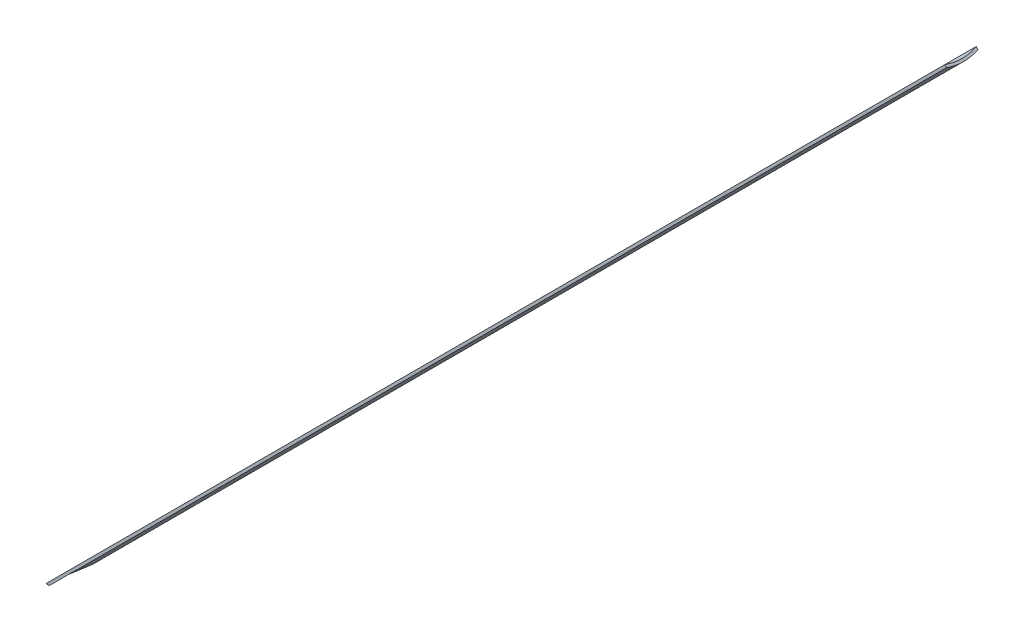
ISO-10303-21;
HEADER;
FILE_DESCRIPTION(('STEP AP214'),'2;1');
FILE_NAME('part.step','',(''),(''),'','','');
FILE_SCHEMA(('AUTOMOTIVE_DESIGN { 1 0 10303 214 1 1 1 1 }'));
ENDSEC;
DATA;
#1=APPLICATION_CONTEXT('core data for automotive mechanical design processes');
#2=APPLICATION_PROTOCOL_DEFINITION('international standard','automotive_design',2000,#1);
#3=PRODUCT_CONTEXT('',#1,'mechanical');
#4=PRODUCT('Part','Part','',(#3));
#5=PRODUCT_RELATED_PRODUCT_CATEGORY('part','',(#4));
#6=PRODUCT_DEFINITION_FORMATION('','',#4);
#7=PRODUCT_DEFINITION_CONTEXT('part definition',#1,'design');
#8=PRODUCT_DEFINITION('design','',#6,#7);
#9=PRODUCT_DEFINITION_SHAPE('','',#8);
#10=(LENGTH_UNIT() NAMED_UNIT(*) SI_UNIT(.MILLI.,.METRE.));
#11=(NAMED_UNIT(*) PLANE_ANGLE_UNIT() SI_UNIT($,.RADIAN.));
#12=(NAMED_UNIT(*) SI_UNIT($,.STERADIAN.) SOLID_ANGLE_UNIT());
#13=UNCERTAINTY_MEASURE_WITH_UNIT(LENGTH_MEASURE(1.E-05),#10,'distance_accuracy_value','');
#14=(GEOMETRIC_REPRESENTATION_CONTEXT(3) GLOBAL_UNCERTAINTY_ASSIGNED_CONTEXT((#13)) GLOBAL_UNIT_ASSIGNED_CONTEXT((#10,
#11,#12)) REPRESENTATION_CONTEXT('',''));
#15=CARTESIAN_POINT('',(0.,0.,0.));
#16=DIRECTION('',(0.,0.,1.));
#17=DIRECTION('',(1.,0.,0.));
#18=AXIS2_PLACEMENT_3D('',#15,#16,#17);
#19=CARTESIAN_POINT('',(3.88908729652602,4.24264068711928,6.5));
#20=DIRECTION('',(0.707106781186546,-0.707106781186549,0.));
#21=DIRECTION('',(0.707106781186549,0.707106781186546,0.));
#22=AXIS2_PLACEMENT_3D('',#19,#20,#21);
#23=PLANE('',#22);
#24=DIRECTION('',(-0.707106781186549,-0.707106781186546,0.));
#25=VECTOR('',#24,1.);
#26=CARTESIAN_POINT('',(3.88908729652602,4.24264068711928,0.));
#27=LINE('',#26,#25);
#28=CARTESIAN_POINT('',(3.88908729652602,4.24264068711928,0.));
#29=VERTEX_POINT('',#28);
#30=CARTESIAN_POINT('',(-0.353553390593274,0.,0.));
#31=VERTEX_POINT('',#30);
#32=EDGE_CURVE('E204',#29,#31,#27,.T.);
#33=ORIENTED_EDGE('',*,*,#32,.T.);
#34=DIRECTION('',(0.,0.,-1.));
#35=VECTOR('',#34,1.);
#36=CARTESIAN_POINT('',(-0.353553390593274,0.,6.5));
#37=LINE('',#36,#35);
#38=CARTESIAN_POINT('',(-0.353553390593274,0.,6.5));
#39=VERTEX_POINT('',#38);
#40=EDGE_CURVE('E12',#39,#31,#37,.T.);
#41=ORIENTED_EDGE('',*,*,#40,.F.);
#42=DIRECTION('',(-0.707106781186549,-0.707106781186546,0.));
#43=VECTOR('',#42,1.);
#44=CARTESIAN_POINT('',(3.88908729652602,4.24264068711928,6.5));
#45=LINE('',#44,#43);
#46=CARTESIAN_POINT('',(3.88908729652602,4.24264068711928,6.5));
#47=VERTEX_POINT('',#46);
#48=EDGE_CURVE('E72',#47,#39,#45,.T.);
#49=ORIENTED_EDGE('',*,*,#48,.F.);
#50=DIRECTION('',(0.,0.,1.));
#51=VECTOR('',#50,1.);
#52=CARTESIAN_POINT('',(3.88908729652602,4.24264068711928,6.5));
#53=LINE('',#52,#51);
#54=EDGE_CURVE('E228',#47,#29,#53,.F.);
#55=ORIENTED_EDGE('',*,*,#54,.T.);
#56=EDGE_LOOP('',(#33,#41,#49,#55));
#57=FACE_BOUND('',#56,.T.);
#58=ADVANCED_FACE('F54',(#57),#23,.F.);
#59=CARTESIAN_POINT('',(0.353553390593274,0.,6.5));
#60=DIRECTION('',(0.,1.,0.));
#61=DIRECTION('',(-1.,0.,0.));
#62=AXIS2_PLACEMENT_3D('',#59,#60,#61);
#63=PLANE('',#62);
#64=DIRECTION('',(1.,0.,0.));
#65=VECTOR('',#64,1.);
#66=CARTESIAN_POINT('',(0.353553390593274,0.,0.));
#67=LINE('',#66,#65);
#68=CARTESIAN_POINT('',(0.353553390593274,0.,0.));
#69=VERTEX_POINT('',#68);
#70=EDGE_CURVE('E235',#31,#69,#67,.T.);
#71=ORIENTED_EDGE('',*,*,#70,.T.);
#72=DIRECTION('',(0.,0.,-1.));
#73=VECTOR('',#72,1.);
#74=CARTESIAN_POINT('',(0.353553390593274,0.,6.5));
#75=LINE('',#74,#73);
#76=CARTESIAN_POINT('',(0.353553390593274,0.,6.5));
#77=VERTEX_POINT('',#76);
#78=EDGE_CURVE('E64',#77,#69,#75,.T.);
#79=ORIENTED_EDGE('',*,*,#78,.F.);
#80=DIRECTION('',(1.,0.,0.));
#81=VECTOR('',#80,1.);
#82=CARTESIAN_POINT('',(0.353553390593274,0.,6.5));
#83=LINE('',#82,#81);
#84=EDGE_CURVE('E225',#39,#77,#83,.T.);
#85=ORIENTED_EDGE('',*,*,#84,.F.);
#86=ORIENTED_EDGE('',*,*,#40,.T.);
#87=EDGE_LOOP('',(#71,#79,#85,#86));
#88=FACE_BOUND('',#87,.T.);
#89=ADVANCED_FACE('F243',(#88),#63,.F.);
#90=CARTESIAN_POINT('',(0.353553390593274,0.,6.5));
#91=DIRECTION('',(-0.707106781186546,0.707106781186549,0.));
#92=DIRECTION('',(-0.707106781186549,-0.707106781186546,0.));
#93=AXIS2_PLACEMENT_3D('',#90,#91,#92);
#94=PLANE('',#93);
#95=DIRECTION('',(0.707106781186549,0.707106781186546,0.));
#96=VECTOR('',#95,1.);
#97=CARTESIAN_POINT('',(0.353553390593274,0.,0.));
#98=LINE('',#97,#96);
#99=CARTESIAN_POINT('',(4.24264068712066,3.88908729652735,0.));
#100=VERTEX_POINT('',#99);
#101=EDGE_CURVE('E237',#69,#100,#98,.T.);
#102=ORIENTED_EDGE('',*,*,#101,.T.);
#103=DIRECTION('',(0.,0.,1.));
#104=VECTOR('',#103,1.);
#105=CARTESIAN_POINT('',(4.24264068711929,3.889087296526,6.5));
#106=LINE('',#105,#104);
#107=CARTESIAN_POINT('',(4.24264068712066,3.88908729652735,6.5));
#108=VERTEX_POINT('',#107);
#109=EDGE_CURVE('E230',#108,#100,#106,.F.);
#110=ORIENTED_EDGE('',*,*,#109,.F.);
#111=DIRECTION('',(0.707106781186549,0.707106781186546,0.));
#112=VECTOR('',#111,1.);
#113=CARTESIAN_POINT('',(0.353553390593274,0.,6.5));
#114=LINE('',#113,#112);
#115=EDGE_CURVE('E231',#77,#108,#114,.T.);
#116=ORIENTED_EDGE('',*,*,#115,.F.);
#117=ORIENTED_EDGE('',*,*,#78,.T.);
#118=EDGE_LOOP('',(#102,#110,#116,#117));
#119=FACE_BOUND('',#118,.T.);
#120=ADVANCED_FACE('F247',(#119),#94,.F.);
#121=CARTESIAN_POINT('',(0.,0.,6.5));
#122=DIRECTION('',(0.,0.,-1.));
#123=DIRECTION('',(-1.,0.,0.));
#124=AXIS2_PLACEMENT_3D('',#121,#122,#123);
#125=PLANE('',#124);
#126=ORIENTED_EDGE('',*,*,#48,.T.);
#127=ORIENTED_EDGE('',*,*,#84,.T.);
#128=ORIENTED_EDGE('',*,*,#115,.T.);
#129=DIRECTION('',(0.712529613361619,0.701642038423256,0.));
#130=VECTOR('',#129,1.);
#131=CARTESIAN_POINT('',(4.24264068711929,3.889087296526,6.5));
#132=LINE('',#131,#130);
#133=CARTESIAN_POINT('',(6.38029287708502,5.99407579367957,6.5));
#134=VERTEX_POINT('',#133);
#135=EDGE_CURVE('E144',#108,#134,#132,.T.);
#136=ORIENTED_EDGE('',*,*,#135,.T.);
#137=DIRECTION('',(-0.707106781186551,-0.707106781186544,0.));
#138=VECTOR('',#137,1.);
#139=CARTESIAN_POINT('',(185.985415298469,185.599198215062,6.5));
#140=LINE('',#139,#138);
#141=CARTESIAN_POINT('',(185.985415298469,185.599198215062,6.5));
#142=VERTEX_POINT('',#141);
#143=EDGE_CURVE('E127',#142,#134,#140,.T.);
#144=ORIENTED_EDGE('',*,*,#143,.F.);
#145=DIRECTION('',(0.707106781186544,-0.707106781186551,0.));
#146=VECTOR('',#145,1.);
#147=CARTESIAN_POINT('',(185.61553006147,185.969083452061,6.5));
#148=LINE('',#147,#146);
#149=CARTESIAN_POINT('',(185.61553006147,185.969083452061,6.5));
#150=VERTEX_POINT('',#149);
#151=EDGE_CURVE('E118',#150,#142,#148,.T.);
#152=ORIENTED_EDGE('',*,*,#151,.F.);
#153=DIRECTION('',(-0.707106781186551,-0.707106781186544,0.));
#154=VECTOR('',#153,1.);
#155=CARTESIAN_POINT('',(185.61553006147,185.969083452061,6.5));
#156=LINE('',#155,#154);
#157=CARTESIAN_POINT('',(6.01040764008567,6.36396103067891,6.5));
#158=VERTEX_POINT('',#157);
#159=EDGE_CURVE('E123',#150,#158,#156,.T.);
#160=ORIENTED_EDGE('',*,*,#159,.T.);
#161=DIRECTION('',(0.707106781186551,0.707106781186544,0.));
#162=VECTOR('',#161,1.);
#163=CARTESIAN_POINT('',(3.88908729652602,4.24264068711928,6.5));
#164=LINE('',#163,#162);
#165=EDGE_CURVE('E146',#47,#158,#164,.T.);
#166=ORIENTED_EDGE('',*,*,#165,.F.);
#167=EDGE_LOOP('',(#126,#127,#128,#136,#144,#152,#160,#166));
#168=FACE_BOUND('',#167,.T.);
#169=ADVANCED_FACE('F120',(#168),#125,.F.);
#170=CARTESIAN_POINT('',(0.,0.,0.));
#171=DIRECTION('',(0.,0.,-1.));
#172=DIRECTION('',(-1.,0.,0.));
#173=AXIS2_PLACEMENT_3D('',#170,#171,#172);
#174=PLANE('',#173);
#175=ORIENTED_EDGE('',*,*,#32,.F.);
#176=DIRECTION('',(0.707106781186551,0.707106781186544,0.));
#177=VECTOR('',#176,1.);
#178=CARTESIAN_POINT('',(3.88908729652602,4.24264068711928,0.));
#179=LINE('',#178,#177);
#180=CARTESIAN_POINT('',(6.01040764008567,6.36396103067891,0.));
#181=VERTEX_POINT('',#180);
#182=EDGE_CURVE('E202',#29,#181,#179,.T.);
#183=ORIENTED_EDGE('',*,*,#182,.T.);
#184=DIRECTION('',(-0.707106781186551,-0.707106781186544,0.));
#185=VECTOR('',#184,1.);
#186=CARTESIAN_POINT('',(185.61553006147,185.969083452061,0.));
#187=LINE('',#186,#185);
#188=CARTESIAN_POINT('',(185.61553006147,185.969083452061,0.));
#189=VERTEX_POINT('',#188);
#190=EDGE_CURVE('E189',#189,#181,#187,.T.);
#191=ORIENTED_EDGE('',*,*,#190,.F.);
#192=DIRECTION('',(-0.707106781186544,0.707106781186551,0.));
#193=VECTOR('',#192,1.);
#194=CARTESIAN_POINT('',(185.985415298469,185.599198215062,0.));
#195=LINE('',#194,#193);
#196=CARTESIAN_POINT('',(185.985415298469,185.599198215062,0.));
#197=VERTEX_POINT('',#196);
#198=EDGE_CURVE('E136',#197,#189,#195,.T.);
#199=ORIENTED_EDGE('',*,*,#198,.F.);
#200=DIRECTION('',(-0.707106781186551,-0.707106781186544,0.));
#201=VECTOR('',#200,1.);
#202=CARTESIAN_POINT('',(185.985415298469,185.599198215062,0.));
#203=LINE('',#202,#201);
#204=CARTESIAN_POINT('',(6.38029287708501,5.99407579367957,0.));
#205=VERTEX_POINT('',#204);
#206=EDGE_CURVE('E148',#197,#205,#203,.T.);
#207=ORIENTED_EDGE('',*,*,#206,.T.);
#208=DIRECTION('',(0.712529613361619,0.701642038423256,0.));
#209=VECTOR('',#208,1.);
#210=CARTESIAN_POINT('',(5.31146678210215,4.94158154510278,0.));
#211=LINE('',#210,#209);
#212=EDGE_CURVE('E206',#100,#205,#211,.T.);
#213=ORIENTED_EDGE('',*,*,#212,.F.);
#214=ORIENTED_EDGE('',*,*,#101,.F.);
#215=ORIENTED_EDGE('',*,*,#70,.F.);
#216=EDGE_LOOP('',(#175,#183,#191,#199,#207,#213,#214,#215));
#217=FACE_BOUND('',#216,.T.);
#218=ADVANCED_FACE('F200',(#217),#174,.T.);
#219=CARTESIAN_POINT('',(3.88908729652602,4.24264068711928,0.));
#220=CARTESIAN_POINT('',(6.01040764008567,6.36396103067891,0.));
#221=CARTESIAN_POINT('',(3.88908729652602,4.24264068711928,1.08333333333333));
#222=CARTESIAN_POINT('',(6.24066013723505,6.13370853352953,1.03323699421965));
#223=CARTESIAN_POINT('',(3.88908729652602,4.24264068711928,2.16666666666666));
#224=CARTESIAN_POINT('',(6.36396103067895,6.01040764008563,2.14102564102564));
#225=CARTESIAN_POINT('',(3.88908729652602,4.24264068711928,4.33333333333333));
#226=CARTESIAN_POINT('',(6.36396103067895,6.01040764008563,4.35897435897436));
#227=CARTESIAN_POINT('',(3.88908729652602,4.24264068711928,5.41666666666666));
#228=CARTESIAN_POINT('',(6.24066013723505,6.13370853352953,5.46676300578035));
#229=CARTESIAN_POINT('',(3.88908729652602,4.24264068711928,6.5));
#230=CARTESIAN_POINT('',(6.01040764008568,6.36396103067891,6.5));
#231=B_SPLINE_SURFACE_WITH_KNOTS('',3,1,((#219,#220),(#221,#222),(#223,#224),(#225,#226),(#227,
#228),(#229,#230)),.UNSPECIFIED.,.F.,.F.,.F.,(4,2,4),(2,2),(0.,0.5,1.),(0.,1.),.UNSPECIFIED.);
#232=CARTESIAN_POINT('',(-1.28163104090056,13.6559997116652,3.25));
#233=DIRECTION('',(-0.707106781186551,-0.707106781186544,0.));
#234=DIRECTION('',(-0.707106781186544,0.707106781186551,0.));
#235=AXIS2_PLACEMENT_3D('',#232,#233,#234);
#236=CIRCLE('',#235,10.8125);
#237=EDGE_CURVE('E57',#181,#158,#236,.T.);
#238=ORIENTED_EDGE('',*,*,#54,.F.);
#239=ORIENTED_EDGE('',*,*,#165,.T.);
#240=ORIENTED_EDGE('',*,*,#237,.F.);
#241=ORIENTED_EDGE('',*,*,#182,.F.);
#242=EDGE_LOOP('',(#238,#239,#240,#241));
#243=FACE_BOUND('',#242,.T.);
#244=ADVANCED_FACE('F180',(#243),#231,.T.);
#245=CARTESIAN_POINT('',(4.24264068711929,3.889087296526,6.5));
#246=CARTESIAN_POINT('',(6.38029287708502,5.99407579367957,6.5));
#247=CARTESIAN_POINT('',(4.24264068711929,3.889087296526,5.41666666666667));
#248=CARTESIAN_POINT('',(6.60036846828304,5.77400020248154,5.46233696248311));
#249=CARTESIAN_POINT('',(4.24264068711929,3.889087296526,4.33333333333334));
#250=CARTESIAN_POINT('',(6.71751442127222,5.65685424949236,4.35666017843364));
#251=CARTESIAN_POINT('',(4.24264068711929,3.889087296526,2.16666666666667));
#252=CARTESIAN_POINT('',(6.71751442127222,5.65685424949236,2.14333982156636));
#253=CARTESIAN_POINT('',(4.24264068711929,3.889087296526,1.08333333333334));
#254=CARTESIAN_POINT('',(6.60036846828304,5.77400020248154,1.0376630375169));
#255=CARTESIAN_POINT('',(4.24264068711929,3.889087296526,0.));
#256=CARTESIAN_POINT('',(6.38029287708502,5.99407579367957,0.));
#257=B_SPLINE_SURFACE_WITH_KNOTS('',3,1,((#245,#246),(#247,#248),(#249,#250),(#251,#252),(#253,
#254),(#255,#256)),.UNSPECIFIED.,.F.,.F.,.F.,(4,2,4),(2,2),(0.,0.5,1.),(0.,1.),.UNSPECIFIED.);
#258=CARTESIAN_POINT('',(-1.28163104090056,13.6559997116652,3.25));
#259=DIRECTION('',(0.707106781186551,0.707106781186544,0.));
#260=DIRECTION('',(-0.707106781186544,0.707106781186551,0.));
#261=AXIS2_PLACEMENT_3D('',#258,#259,#260);
#262=CIRCLE('',#261,11.3125);
#263=EDGE_CURVE('E160',#134,#205,#262,.T.);
#264=ORIENTED_EDGE('',*,*,#109,.T.);
#265=ORIENTED_EDGE('',*,*,#212,.T.);
#266=ORIENTED_EDGE('',*,*,#263,.F.);
#267=ORIENTED_EDGE('',*,*,#135,.F.);
#268=EDGE_LOOP('',(#264,#265,#266,#267));
#269=FACE_BOUND('',#268,.T.);
#270=ADVANCED_FACE('F179',(#269),#257,.T.);
#271=CARTESIAN_POINT('',(178.323491380483,193.261122133047,3.25));
#272=DIRECTION('',(-0.707106781186551,-0.707106781186544,0.));
#273=DIRECTION('',(0.707106781186544,-0.707106781186551,0.));
#274=AXIS2_PLACEMENT_3D('',#271,#272,#273);
#275=CYLINDRICAL_SURFACE('',#274,10.8125);
#276=ORIENTED_EDGE('',*,*,#237,.T.);
#277=ORIENTED_EDGE('',*,*,#159,.F.);
#278=CARTESIAN_POINT('',(178.323491380483,193.261122133047,3.25));
#279=DIRECTION('',(-0.707106781186551,-0.707106781186544,0.));
#280=DIRECTION('',(-0.707106781186544,0.707106781186551,0.));
#281=AXIS2_PLACEMENT_3D('',#278,#279,#280);
#282=CIRCLE('',#281,10.8125);
#283=EDGE_CURVE('E131',#189,#150,#282,.T.);
#284=ORIENTED_EDGE('',*,*,#283,.F.);
#285=ORIENTED_EDGE('',*,*,#190,.T.);
#286=EDGE_LOOP('',(#276,#277,#284,#285));
#287=FACE_BOUND('',#286,.T.);
#288=ADVANCED_FACE('F141',(#287),#275,.F.);
#289=CARTESIAN_POINT('',(178.323491380483,193.261122133047,3.25));
#290=DIRECTION('',(-0.707106781186551,-0.707106781186544,0.));
#291=DIRECTION('',(0.707106781186544,-0.707106781186551,0.));
#292=AXIS2_PLACEMENT_3D('',#289,#290,#291);
#293=CYLINDRICAL_SURFACE('',#292,11.3125);
#294=ORIENTED_EDGE('',*,*,#263,.T.);
#295=ORIENTED_EDGE('',*,*,#206,.F.);
#296=CARTESIAN_POINT('',(178.323491380483,193.261122133047,3.25));
#297=DIRECTION('',(0.707106781186551,0.707106781186544,0.));
#298=DIRECTION('',(-0.707106781186544,0.707106781186551,0.));
#299=AXIS2_PLACEMENT_3D('',#296,#297,#298);
#300=CIRCLE('',#299,11.3125);
#301=EDGE_CURVE('E130',#142,#197,#300,.T.);
#302=ORIENTED_EDGE('',*,*,#301,.F.);
#303=ORIENTED_EDGE('',*,*,#143,.T.);
#304=EDGE_LOOP('',(#294,#295,#302,#303));
#305=FACE_BOUND('',#304,.T.);
#306=ADVANCED_FACE('F166',(#305),#293,.T.);
#307=CARTESIAN_POINT('',(178.323491380483,193.261122133047,3.25));
#308=DIRECTION('',(0.707106781186551,0.707106781186544,0.));
#309=DIRECTION('',(-0.707106781186544,0.707106781186551,0.));
#310=AXIS2_PLACEMENT_3D('',#307,#308,#309);
#311=PLANE('',#310);
#312=ORIENTED_EDGE('',*,*,#283,.T.);
#313=ORIENTED_EDGE('',*,*,#151,.T.);
#314=ORIENTED_EDGE('',*,*,#301,.T.);
#315=ORIENTED_EDGE('',*,*,#198,.T.);
#316=EDGE_LOOP('',(#312,#313,#314,#315));
#317=FACE_BOUND('',#316,.T.);
#318=ADVANCED_FACE('F134',(#317),#311,.T.);
#319=CLOSED_SHELL('',(#58,#89,#120,#169,#218,#244,#270,#288,#306,#318));
#320=MANIFOLD_SOLID_BREP('B2',#319);
#321=ADVANCED_BREP_SHAPE_REPRESENTATION('',(#18,#320),#14);
#322=SHAPE_DEFINITION_REPRESENTATION(#9,#321);
ENDSEC;
END-ISO-10303-21;
